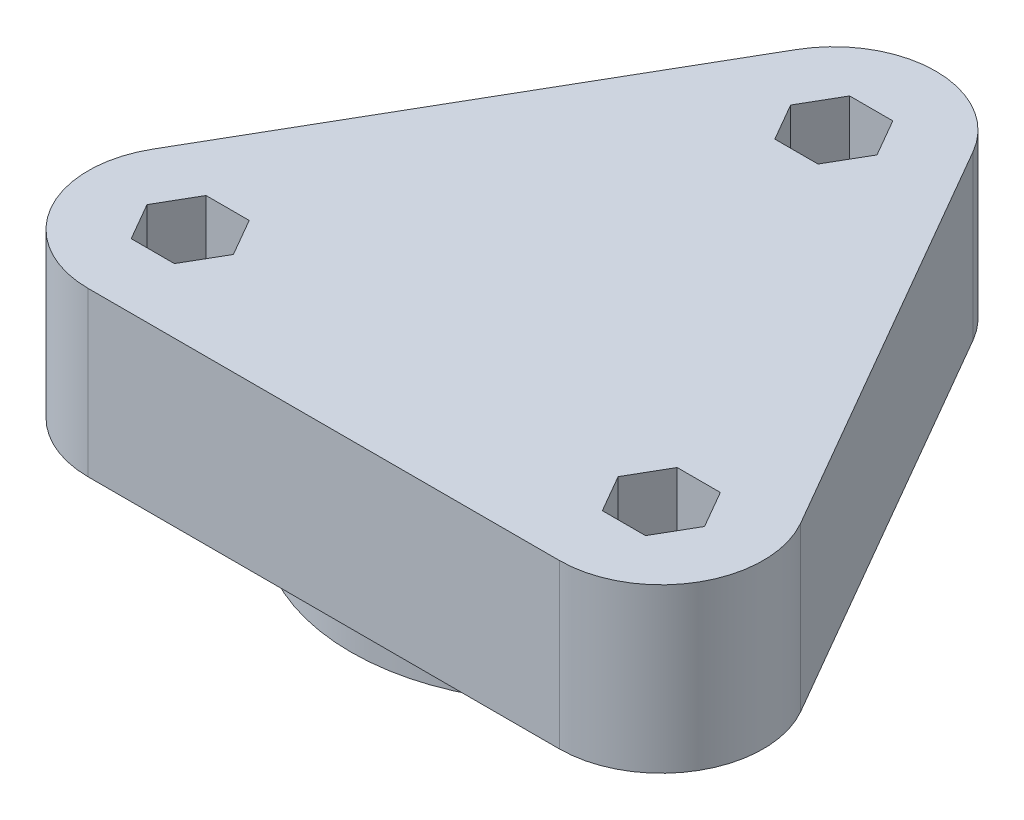
ISO-10303-21;
HEADER;
FILE_DESCRIPTION(('STEP AP214'),'2;1');
FILE_NAME('part.step','',(''),(''),'','','');
FILE_SCHEMA(('AUTOMOTIVE_DESIGN { 1 0 10303 214 1 1 1 1 }'));
ENDSEC;
DATA;
#1=APPLICATION_CONTEXT('core data for automotive mechanical design processes');
#2=APPLICATION_PROTOCOL_DEFINITION('international standard','automotive_design',2000,#1);
#3=PRODUCT_CONTEXT('',#1,'mechanical');
#4=PRODUCT('Part','Part','',(#3));
#5=PRODUCT_RELATED_PRODUCT_CATEGORY('part','',(#4));
#6=PRODUCT_DEFINITION_FORMATION('','',#4);
#7=PRODUCT_DEFINITION_CONTEXT('part definition',#1,'design');
#8=PRODUCT_DEFINITION('design','',#6,#7);
#9=PRODUCT_DEFINITION_SHAPE('','',#8);
#10=(LENGTH_UNIT() NAMED_UNIT(*) SI_UNIT(.MILLI.,.METRE.));
#11=(NAMED_UNIT(*) PLANE_ANGLE_UNIT() SI_UNIT($,.RADIAN.));
#12=(NAMED_UNIT(*) SI_UNIT($,.STERADIAN.) SOLID_ANGLE_UNIT());
#13=UNCERTAINTY_MEASURE_WITH_UNIT(LENGTH_MEASURE(1.E-05),#10,'distance_accuracy_value','');
#14=(GEOMETRIC_REPRESENTATION_CONTEXT(3) GLOBAL_UNCERTAINTY_ASSIGNED_CONTEXT((#13)) GLOBAL_UNIT_ASSIGNED_CONTEXT((#10,
#11,#12)) REPRESENTATION_CONTEXT('',''));
#15=CARTESIAN_POINT('',(0.,0.,0.));
#16=DIRECTION('',(0.,0.,1.));
#17=DIRECTION('',(1.,0.,0.));
#18=AXIS2_PLACEMENT_3D('',#15,#16,#17);
#19=CARTESIAN_POINT('',(0.,0.,-20.));
#20=DIRECTION('',(0.,1.,0.));
#21=DIRECTION('',(0.,0.,1.));
#22=AXIS2_PLACEMENT_3D('',#19,#20,#21);
#23=PLANE('',#22);
#24=CARTESIAN_POINT('',(17.3205080756887,0.,10.0000000000001));
#25=DIRECTION('',(0.,1.,0.));
#26=DIRECTION('',(0.,0.,1.));
#27=AXIS2_PLACEMENT_3D('',#24,#25,#26);
#28=CIRCLE('',#27,1.6);
#29=CARTESIAN_POINT('',(17.3205080756887,0.,11.6000000000001));
#30=VERTEX_POINT('',#29);
#31=EDGE_CURVE('E350',#30,#30,#28,.T.);
#32=ORIENTED_EDGE('',*,*,#31,.T.);
#33=EDGE_LOOP('',(#32));
#34=FACE_BOUND('',#33,.T.);
#35=CARTESIAN_POINT('',(-17.3205080756887,0.,10.0000000000001));
#36=DIRECTION('',(0.,1.,0.));
#37=DIRECTION('',(0.,0.,1.));
#38=AXIS2_PLACEMENT_3D('',#35,#36,#37);
#39=CIRCLE('',#38,1.6);
#40=CARTESIAN_POINT('',(-17.3205080756887,0.,11.6000000000001));
#41=VERTEX_POINT('',#40);
#42=EDGE_CURVE('E353',#41,#41,#39,.T.);
#43=ORIENTED_EDGE('',*,*,#42,.T.);
#44=EDGE_LOOP('',(#43));
#45=FACE_BOUND('',#44,.T.);
#46=CARTESIAN_POINT('',(0.,0.,-20.));
#47=DIRECTION('',(0.,1.,0.));
#48=DIRECTION('',(0.,0.,1.));
#49=AXIS2_PLACEMENT_3D('',#46,#47,#48);
#50=CIRCLE('',#49,1.6);
#51=CARTESIAN_POINT('',(0.,0.,-18.4));
#52=VERTEX_POINT('',#51);
#53=EDGE_CURVE('E356',#52,#52,#50,.T.);
#54=ORIENTED_EDGE('',*,*,#53,.T.);
#55=EDGE_LOOP('',(#54));
#56=FACE_BOUND('',#55,.T.);
#57=CARTESIAN_POINT('',(0.,0.,-20.));
#58=DIRECTION('',(0.,1.,0.));
#59=DIRECTION('',(0.,0.,1.));
#60=AXIS2_PLACEMENT_3D('',#57,#58,#59);
#61=CIRCLE('',#60,7.49999999999992);
#62=CARTESIAN_POINT('',(6.49519052838323,0.,-23.7499999999999));
#63=VERTEX_POINT('',#62);
#64=CARTESIAN_POINT('',(-6.49519052838323,0.,-23.7499999999999));
#65=VERTEX_POINT('',#64);
#66=EDGE_CURVE('E359',#63,#65,#61,.T.);
#67=ORIENTED_EDGE('',*,*,#66,.F.);
#68=DIRECTION('',(-0.499999999999998,0.,-0.86602540378444));
#69=VECTOR('',#68,1.);
#70=CARTESIAN_POINT('',(6.49519052838323,0.,-23.7499999999999));
#71=LINE('',#70,#69);
#72=CARTESIAN_POINT('',(23.815698604072,0.,6.25000000000013));
#73=VERTEX_POINT('',#72);
#74=EDGE_CURVE('E364',#73,#63,#71,.T.);
#75=ORIENTED_EDGE('',*,*,#74,.F.);
#76=CARTESIAN_POINT('',(17.3205080756887,0.,10.0000000000001));
#77=DIRECTION('',(0.,1.,0.));
#78=DIRECTION('',(0.,0.,1.));
#79=AXIS2_PLACEMENT_3D('',#76,#77,#78);
#80=CIRCLE('',#79,7.49999999999993);
#81=CARTESIAN_POINT('',(17.3205080756887,0.,17.5));
#82=VERTEX_POINT('',#81);
#83=EDGE_CURVE('E383',#82,#73,#80,.T.);
#84=ORIENTED_EDGE('',*,*,#83,.F.);
#85=DIRECTION('',(1.,0.,0.));
#86=VECTOR('',#85,1.);
#87=CARTESIAN_POINT('',(-17.3205080756887,0.,17.5));
#88=LINE('',#87,#86);
#89=CARTESIAN_POINT('',(-17.3205080756887,0.,17.5));
#90=VERTEX_POINT('',#89);
#91=EDGE_CURVE('E381',#90,#82,#88,.T.);
#92=ORIENTED_EDGE('',*,*,#91,.F.);
#93=CARTESIAN_POINT('',(-17.3205080756887,0.,10.0000000000001));
#94=DIRECTION('',(0.,1.,0.));
#95=DIRECTION('',(0.,0.,1.));
#96=AXIS2_PLACEMENT_3D('',#93,#94,#95);
#97=CIRCLE('',#96,7.49999999999993);
#98=CARTESIAN_POINT('',(-23.815698604072,0.,6.25000000000013));
#99=VERTEX_POINT('',#98);
#100=EDGE_CURVE('E379',#99,#90,#97,.T.);
#101=ORIENTED_EDGE('',*,*,#100,.F.);
#102=DIRECTION('',(-0.499999999999998,0.,0.86602540378444));
#103=VECTOR('',#102,1.);
#104=CARTESIAN_POINT('',(-6.49519052838323,0.,-23.7499999999999));
#105=LINE('',#104,#103);
#106=EDGE_CURVE('E377',#65,#99,#105,.T.);
#107=ORIENTED_EDGE('',*,*,#106,.F.);
#108=EDGE_LOOP('',(#67,#75,#84,#92,#101,#107));
#109=FACE_BOUND('',#108,.T.);
#110=CARTESIAN_POINT('',(0.,0.,0.));
#111=DIRECTION('',(0.,1.,0.));
#112=DIRECTION('',(0.,0.,1.));
#113=AXIS2_PLACEMENT_3D('',#110,#111,#112);
#114=CIRCLE('',#113,15.5);
#115=CARTESIAN_POINT('',(0.,0.,15.5));
#116=VERTEX_POINT('',#115);
#117=EDGE_CURVE('E11',#116,#116,#114,.F.);
#118=ORIENTED_EDGE('',*,*,#117,.F.);
#119=EDGE_LOOP('',(#118));
#120=FACE_BOUND('',#119,.T.);
#121=ADVANCED_FACE('F35',(#34,#45,#56,#109,#120),#23,.F.);
#122=CARTESIAN_POINT('',(17.3205080756887,12.,10.0000000000001));
#123=DIRECTION('',(0.,-1.,0.));
#124=DIRECTION('',(0.,0.,-1.));
#125=AXIS2_PLACEMENT_3D('',#122,#123,#124);
#126=CYLINDRICAL_SURFACE('',#125,1.6);
#127=ORIENTED_EDGE('',*,*,#31,.F.);
#128=EDGE_LOOP('',(#127));
#129=FACE_BOUND('',#128,.T.);
#130=CARTESIAN_POINT('',(17.3205080756887,7.,10.0000000000001));
#131=DIRECTION('',(0.,1.,0.));
#132=DIRECTION('',(0.,0.,1.));
#133=AXIS2_PLACEMENT_3D('',#130,#131,#132);
#134=CIRCLE('',#133,1.6);
#135=CARTESIAN_POINT('',(17.3205080756887,7.,11.6000000000001));
#136=VERTEX_POINT('',#135);
#137=EDGE_CURVE('E246',#136,#136,#134,.T.);
#138=ORIENTED_EDGE('',*,*,#137,.T.);
#139=EDGE_LOOP('',(#138));
#140=FACE_BOUND('',#139,.T.);
#141=ADVANCED_FACE('F408',(#129,#140),#126,.F.);
#142=CARTESIAN_POINT('',(0.,12.,-20.));
#143=DIRECTION('',(0.,-1.,0.));
#144=DIRECTION('',(0.,0.,-1.));
#145=AXIS2_PLACEMENT_3D('',#142,#143,#144);
#146=CYLINDRICAL_SURFACE('',#145,1.6);
#147=ORIENTED_EDGE('',*,*,#53,.F.);
#148=EDGE_LOOP('',(#147));
#149=FACE_BOUND('',#148,.T.);
#150=CARTESIAN_POINT('',(0.,7.,-20.));
#151=DIRECTION('',(0.,1.,0.));
#152=DIRECTION('',(0.,0.,1.));
#153=AXIS2_PLACEMENT_3D('',#150,#151,#152);
#154=CIRCLE('',#153,1.6);
#155=CARTESIAN_POINT('',(0.,7.,-18.4));
#156=VERTEX_POINT('',#155);
#157=EDGE_CURVE('E291',#156,#156,#154,.T.);
#158=ORIENTED_EDGE('',*,*,#157,.T.);
#159=EDGE_LOOP('',(#158));
#160=FACE_BOUND('',#159,.T.);
#161=ADVANCED_FACE('F430',(#149,#160),#146,.F.);
#162=CARTESIAN_POINT('',(-17.3205080756887,12.,10.0000000000001));
#163=DIRECTION('',(0.,-1.,0.));
#164=DIRECTION('',(0.,0.,-1.));
#165=AXIS2_PLACEMENT_3D('',#162,#163,#164);
#166=CYLINDRICAL_SURFACE('',#165,1.6);
#167=ORIENTED_EDGE('',*,*,#42,.F.);
#168=EDGE_LOOP('',(#167));
#169=FACE_BOUND('',#168,.T.);
#170=CARTESIAN_POINT('',(-17.3205080756887,7.,10.0000000000001));
#171=DIRECTION('',(0.,1.,0.));
#172=DIRECTION('',(0.,0.,1.));
#173=AXIS2_PLACEMENT_3D('',#170,#171,#172);
#174=CIRCLE('',#173,1.6);
#175=CARTESIAN_POINT('',(-17.3205080756887,7.,11.6000000000001));
#176=VERTEX_POINT('',#175);
#177=EDGE_CURVE('E339',#176,#176,#174,.T.);
#178=ORIENTED_EDGE('',*,*,#177,.T.);
#179=EDGE_LOOP('',(#178));
#180=FACE_BOUND('',#179,.T.);
#181=ADVANCED_FACE('F481',(#169,#180),#166,.F.);
#182=CARTESIAN_POINT('',(0.,12.,-20.));
#183=DIRECTION('',(0.,1.,0.));
#184=DIRECTION('',(0.,0.,1.));
#185=AXIS2_PLACEMENT_3D('',#182,#183,#184);
#186=PLANE('',#185);
#187=DIRECTION('',(-0.500000000000001,0.,-0.866025403784438));
#188=VECTOR('',#187,1.);
#189=CARTESIAN_POINT('',(20.4959345562317,12.,10.0000000000001));
#190=LINE('',#189,#188);
#191=CARTESIAN_POINT('',(20.4959345562317,12.,10.0000000000001));
#192=VERTEX_POINT('',#191);
#193=CARTESIAN_POINT('',(18.9082213159602,12.,7.25000000000007));
#194=VERTEX_POINT('',#193);
#195=EDGE_CURVE('E50',#192,#194,#190,.T.);
#196=ORIENTED_EDGE('',*,*,#195,.F.);
#197=DIRECTION('',(0.5,0.,-0.866025403784439));
#198=VECTOR('',#197,1.);
#199=CARTESIAN_POINT('',(18.9082213159602,12.,12.7500000000001));
#200=LINE('',#199,#198);
#201=CARTESIAN_POINT('',(18.9082213159602,12.,12.7500000000001));
#202=VERTEX_POINT('',#201);
#203=EDGE_CURVE('E217',#202,#192,#200,.T.);
#204=ORIENTED_EDGE('',*,*,#203,.F.);
#205=DIRECTION('',(1.,0.,0.));
#206=VECTOR('',#205,1.);
#207=CARTESIAN_POINT('',(15.7327948354173,12.,12.7500000000001));
#208=LINE('',#207,#206);
#209=CARTESIAN_POINT('',(15.7327948354173,12.,12.7500000000001));
#210=VERTEX_POINT('',#209);
#211=EDGE_CURVE('E220',#210,#202,#208,.T.);
#212=ORIENTED_EDGE('',*,*,#211,.F.);
#213=DIRECTION('',(0.500000000000001,0.,0.866025403784438));
#214=VECTOR('',#213,1.);
#215=CARTESIAN_POINT('',(14.1450815951458,12.,10.0000000000001));
#216=LINE('',#215,#214);
#217=CARTESIAN_POINT('',(14.1450815951458,12.,10.0000000000001));
#218=VERTEX_POINT('',#217);
#219=EDGE_CURVE('E239',#218,#210,#216,.T.);
#220=ORIENTED_EDGE('',*,*,#219,.F.);
#221=DIRECTION('',(-0.500000000000001,0.,0.866025403784438));
#222=VECTOR('',#221,1.);
#223=CARTESIAN_POINT('',(15.7327948354173,12.,7.25000000000008));
#224=LINE('',#223,#222);
#225=CARTESIAN_POINT('',(15.7327948354173,12.,7.25000000000008));
#226=VERTEX_POINT('',#225);
#227=EDGE_CURVE('E236',#226,#218,#224,.T.);
#228=ORIENTED_EDGE('',*,*,#227,.F.);
#229=DIRECTION('',(-1.,0.,0.));
#230=VECTOR('',#229,1.);
#231=CARTESIAN_POINT('',(18.9082213159602,12.,7.25000000000008));
#232=LINE('',#231,#230);
#233=EDGE_CURVE('E234',#194,#226,#232,.T.);
#234=ORIENTED_EDGE('',*,*,#233,.F.);
#235=EDGE_LOOP('',(#196,#204,#212,#220,#228,#234));
#236=FACE_BOUND('',#235,.T.);
#237=DIRECTION('',(-1.,0.,0.));
#238=VECTOR('',#237,1.);
#239=CARTESIAN_POINT('',(1.58771324027147,12.,-22.75));
#240=LINE('',#239,#238);
#241=CARTESIAN_POINT('',(1.58771324027147,12.,-22.75));
#242=VERTEX_POINT('',#241);
#243=CARTESIAN_POINT('',(-1.58771324027147,12.,-22.75));
#244=VERTEX_POINT('',#243);
#245=EDGE_CURVE('E58',#242,#244,#240,.T.);
#246=ORIENTED_EDGE('',*,*,#245,.F.);
#247=DIRECTION('',(-0.5,0.,-0.866025403784439));
#248=VECTOR('',#247,1.);
#249=CARTESIAN_POINT('',(3.17542648054294,12.,-20.));
#250=LINE('',#249,#248);
#251=CARTESIAN_POINT('',(3.17542648054294,12.,-20.));
#252=VERTEX_POINT('',#251);
#253=EDGE_CURVE('E258',#252,#242,#250,.T.);
#254=ORIENTED_EDGE('',*,*,#253,.F.);
#255=DIRECTION('',(0.5,0.,-0.866025403784439));
#256=VECTOR('',#255,1.);
#257=CARTESIAN_POINT('',(1.58771324027147,12.,-17.25));
#258=LINE('',#257,#256);
#259=CARTESIAN_POINT('',(1.58771324027147,12.,-17.25));
#260=VERTEX_POINT('',#259);
#261=EDGE_CURVE('E284',#260,#252,#258,.T.);
#262=ORIENTED_EDGE('',*,*,#261,.F.);
#263=DIRECTION('',(1.,0.,0.));
#264=VECTOR('',#263,1.);
#265=CARTESIAN_POINT('',(-1.58771324027147,12.,-17.25));
#266=LINE('',#265,#264);
#267=CARTESIAN_POINT('',(-1.58771324027147,12.,-17.25));
#268=VERTEX_POINT('',#267);
#269=EDGE_CURVE('E281',#268,#260,#266,.T.);
#270=ORIENTED_EDGE('',*,*,#269,.F.);
#271=DIRECTION('',(0.5,0.,0.866025403784439));
#272=VECTOR('',#271,1.);
#273=CARTESIAN_POINT('',(-3.17542648054294,12.,-20.));
#274=LINE('',#273,#272);
#275=CARTESIAN_POINT('',(-3.17542648054294,12.,-20.));
#276=VERTEX_POINT('',#275);
#277=EDGE_CURVE('E278',#276,#268,#274,.T.);
#278=ORIENTED_EDGE('',*,*,#277,.F.);
#279=DIRECTION('',(-0.499999999999999,0.,0.866025403784439));
#280=VECTOR('',#279,1.);
#281=CARTESIAN_POINT('',(-1.58771324027147,12.,-22.75));
#282=LINE('',#281,#280);
#283=EDGE_CURVE('E275',#244,#276,#282,.T.);
#284=ORIENTED_EDGE('',*,*,#283,.F.);
#285=EDGE_LOOP('',(#246,#254,#262,#270,#278,#284));
#286=FACE_BOUND('',#285,.T.);
#287=DIRECTION('',(-1.,0.,0.));
#288=VECTOR('',#287,1.);
#289=CARTESIAN_POINT('',(-15.7327948354173,12.,7.25000000000008));
#290=LINE('',#289,#288);
#291=CARTESIAN_POINT('',(-15.7327948354173,12.,7.25000000000008));
#292=VERTEX_POINT('',#291);
#293=CARTESIAN_POINT('',(-18.9082213159602,12.,7.25000000000008));
#294=VERTEX_POINT('',#293);
#295=EDGE_CURVE('E321',#292,#294,#290,.T.);
#296=ORIENTED_EDGE('',*,*,#295,.F.);
#297=DIRECTION('',(-0.5,0.,-0.866025403784439));
#298=VECTOR('',#297,1.);
#299=CARTESIAN_POINT('',(-14.1450815951458,12.,10.0000000000001));
#300=LINE('',#299,#298);
#301=CARTESIAN_POINT('',(-14.1450815951458,12.,10.0000000000001));
#302=VERTEX_POINT('',#301);
#303=EDGE_CURVE('E305',#302,#292,#300,.T.);
#304=ORIENTED_EDGE('',*,*,#303,.F.);
#305=DIRECTION('',(0.5,0.,-0.866025403784439));
#306=VECTOR('',#305,1.);
#307=CARTESIAN_POINT('',(-15.7327948354173,12.,12.7500000000001));
#308=LINE('',#307,#306);
#309=CARTESIAN_POINT('',(-15.7327948354173,12.,12.7500000000001));
#310=VERTEX_POINT('',#309);
#311=EDGE_CURVE('E332',#310,#302,#308,.T.);
#312=ORIENTED_EDGE('',*,*,#311,.F.);
#313=DIRECTION('',(1.,0.,0.));
#314=VECTOR('',#313,1.);
#315=CARTESIAN_POINT('',(-18.9082213159602,12.,12.7500000000001));
#316=LINE('',#315,#314);
#317=CARTESIAN_POINT('',(-18.9082213159602,12.,12.7500000000001));
#318=VERTEX_POINT('',#317);
#319=EDGE_CURVE('E329',#318,#310,#316,.T.);
#320=ORIENTED_EDGE('',*,*,#319,.F.);
#321=DIRECTION('',(0.5,0.,0.866025403784439));
#322=VECTOR('',#321,1.);
#323=CARTESIAN_POINT('',(-20.4959345562317,12.,10.0000000000001));
#324=LINE('',#323,#322);
#325=CARTESIAN_POINT('',(-20.4959345562317,12.,10.0000000000001));
#326=VERTEX_POINT('',#325);
#327=EDGE_CURVE('E326',#326,#318,#324,.T.);
#328=ORIENTED_EDGE('',*,*,#327,.F.);
#329=DIRECTION('',(-0.5,0.,0.866025403784439));
#330=VECTOR('',#329,1.);
#331=CARTESIAN_POINT('',(-18.9082213159602,12.,7.25000000000008));
#332=LINE('',#331,#330);
#333=EDGE_CURVE('E323',#294,#326,#332,.T.);
#334=ORIENTED_EDGE('',*,*,#333,.F.);
#335=EDGE_LOOP('',(#296,#304,#312,#320,#328,#334));
#336=FACE_BOUND('',#335,.T.);
#337=CARTESIAN_POINT('',(0.,12.,-20.));
#338=DIRECTION('',(0.,1.,0.));
#339=DIRECTION('',(0.,0.,1.));
#340=AXIS2_PLACEMENT_3D('',#337,#338,#339);
#341=CIRCLE('',#340,7.49999999999992);
#342=CARTESIAN_POINT('',(6.49519052838323,12.,-23.7499999999999));
#343=VERTEX_POINT('',#342);
#344=CARTESIAN_POINT('',(-6.49519052838323,12.,-23.7499999999999));
#345=VERTEX_POINT('',#344);
#346=EDGE_CURVE('E360',#343,#345,#341,.T.);
#347=ORIENTED_EDGE('',*,*,#346,.T.);
#348=DIRECTION('',(-0.499999999999998,0.,0.86602540378444));
#349=VECTOR('',#348,1.);
#350=CARTESIAN_POINT('',(-6.49519052838323,12.,-23.7499999999999));
#351=LINE('',#350,#349);
#352=CARTESIAN_POINT('',(-23.815698604072,12.,6.25000000000013));
#353=VERTEX_POINT('',#352);
#354=EDGE_CURVE('E363',#345,#353,#351,.T.);
#355=ORIENTED_EDGE('',*,*,#354,.T.);
#356=CARTESIAN_POINT('',(-17.3205080756887,12.,10.0000000000001));
#357=DIRECTION('',(0.,1.,0.));
#358=DIRECTION('',(0.,0.,1.));
#359=AXIS2_PLACEMENT_3D('',#356,#357,#358);
#360=CIRCLE('',#359,7.49999999999993);
#361=CARTESIAN_POINT('',(-17.3205080756887,12.,17.5));
#362=VERTEX_POINT('',#361);
#363=EDGE_CURVE('E366',#353,#362,#360,.T.);
#364=ORIENTED_EDGE('',*,*,#363,.T.);
#365=DIRECTION('',(1.,0.,0.));
#366=VECTOR('',#365,1.);
#367=CARTESIAN_POINT('',(-17.3205080756887,12.,17.5));
#368=LINE('',#367,#366);
#369=CARTESIAN_POINT('',(17.3205080756887,12.,17.5));
#370=VERTEX_POINT('',#369);
#371=EDGE_CURVE('E368',#362,#370,#368,.T.);
#372=ORIENTED_EDGE('',*,*,#371,.T.);
#373=CARTESIAN_POINT('',(17.3205080756887,12.,10.0000000000001));
#374=DIRECTION('',(0.,1.,0.));
#375=DIRECTION('',(0.,0.,1.));
#376=AXIS2_PLACEMENT_3D('',#373,#374,#375);
#377=CIRCLE('',#376,7.49999999999993);
#378=CARTESIAN_POINT('',(23.815698604072,12.,6.25000000000013));
#379=VERTEX_POINT('',#378);
#380=EDGE_CURVE('E370',#370,#379,#377,.T.);
#381=ORIENTED_EDGE('',*,*,#380,.T.);
#382=DIRECTION('',(-0.499999999999998,0.,-0.86602540378444));
#383=VECTOR('',#382,1.);
#384=CARTESIAN_POINT('',(6.49519052838323,12.,-23.7499999999999));
#385=LINE('',#384,#383);
#386=EDGE_CURVE('E372',#379,#343,#385,.T.);
#387=ORIENTED_EDGE('',*,*,#386,.T.);
#388=EDGE_LOOP('',(#347,#355,#364,#372,#381,#387));
#389=FACE_BOUND('',#388,.T.);
#390=ADVANCED_FACE('F436',(#236,#286,#336,#389),#186,.T.);
#391=CARTESIAN_POINT('',(0.,12.,-20.));
#392=DIRECTION('',(0.,-1.,0.));
#393=DIRECTION('',(0.,0.,-1.));
#394=AXIS2_PLACEMENT_3D('',#391,#392,#393);
#395=CYLINDRICAL_SURFACE('',#394,7.49999999999992);
#396=ORIENTED_EDGE('',*,*,#66,.T.);
#397=DIRECTION('',(0.,-1.,0.));
#398=VECTOR('',#397,1.);
#399=CARTESIAN_POINT('',(-6.49519052838323,12.,-23.7499999999999));
#400=LINE('',#399,#398);
#401=EDGE_CURVE('E43',#345,#65,#400,.T.);
#402=ORIENTED_EDGE('',*,*,#401,.F.);
#403=ORIENTED_EDGE('',*,*,#346,.F.);
#404=DIRECTION('',(0.,-1.,0.));
#405=VECTOR('',#404,1.);
#406=CARTESIAN_POINT('',(6.49519052838323,12.,-23.7499999999999));
#407=LINE('',#406,#405);
#408=EDGE_CURVE('E374',#343,#63,#407,.T.);
#409=ORIENTED_EDGE('',*,*,#408,.T.);
#410=EDGE_LOOP('',(#396,#402,#403,#409));
#411=FACE_BOUND('',#410,.T.);
#412=ADVANCED_FACE('F37',(#411),#395,.T.);
#413=CARTESIAN_POINT('',(-6.49519052838323,12.,-23.7499999999999));
#414=DIRECTION('',(0.86602540378444,0.,0.499999999999998));
#415=DIRECTION('',(0.499999999999998,0.,-0.86602540378444));
#416=AXIS2_PLACEMENT_3D('',#413,#414,#415);
#417=PLANE('',#416);
#418=ORIENTED_EDGE('',*,*,#106,.T.);
#419=DIRECTION('',(0.,-1.,0.));
#420=VECTOR('',#419,1.);
#421=CARTESIAN_POINT('',(-23.815698604072,12.,6.25000000000013));
#422=LINE('',#421,#420);
#423=EDGE_CURVE('E397',#353,#99,#422,.T.);
#424=ORIENTED_EDGE('',*,*,#423,.F.);
#425=ORIENTED_EDGE('',*,*,#354,.F.);
#426=ORIENTED_EDGE('',*,*,#401,.T.);
#427=EDGE_LOOP('',(#418,#424,#425,#426));
#428=FACE_BOUND('',#427,.T.);
#429=ADVANCED_FACE('F453',(#428),#417,.F.);
#430=CARTESIAN_POINT('',(-17.3205080756887,12.,10.0000000000001));
#431=DIRECTION('',(0.,-1.,0.));
#432=DIRECTION('',(0.,0.,-1.));
#433=AXIS2_PLACEMENT_3D('',#430,#431,#432);
#434=CYLINDRICAL_SURFACE('',#433,7.49999999999993);
#435=ORIENTED_EDGE('',*,*,#100,.T.);
#436=DIRECTION('',(0.,-1.,0.));
#437=VECTOR('',#436,1.);
#438=CARTESIAN_POINT('',(-17.3205080756887,12.,17.5));
#439=LINE('',#438,#437);
#440=EDGE_CURVE('E394',#362,#90,#439,.T.);
#441=ORIENTED_EDGE('',*,*,#440,.F.);
#442=ORIENTED_EDGE('',*,*,#363,.F.);
#443=ORIENTED_EDGE('',*,*,#423,.T.);
#444=EDGE_LOOP('',(#435,#441,#442,#443));
#445=FACE_BOUND('',#444,.T.);
#446=ADVANCED_FACE('F450',(#445),#434,.T.);
#447=CARTESIAN_POINT('',(-17.3205080756887,12.,17.5));
#448=DIRECTION('',(0.,0.,-1.));
#449=DIRECTION('',(-1.,0.,0.));
#450=AXIS2_PLACEMENT_3D('',#447,#448,#449);
#451=PLANE('',#450);
#452=ORIENTED_EDGE('',*,*,#91,.T.);
#453=DIRECTION('',(0.,-1.,0.));
#454=VECTOR('',#453,1.);
#455=CARTESIAN_POINT('',(17.3205080756887,12.,17.5));
#456=LINE('',#455,#454);
#457=EDGE_CURVE('E391',#370,#82,#456,.T.);
#458=ORIENTED_EDGE('',*,*,#457,.F.);
#459=ORIENTED_EDGE('',*,*,#371,.F.);
#460=ORIENTED_EDGE('',*,*,#440,.T.);
#461=EDGE_LOOP('',(#452,#458,#459,#460));
#462=FACE_BOUND('',#461,.T.);
#463=ADVANCED_FACE('F446',(#462),#451,.F.);
#464=CARTESIAN_POINT('',(17.3205080756887,12.,10.0000000000001));
#465=DIRECTION('',(0.,-1.,0.));
#466=DIRECTION('',(0.,0.,-1.));
#467=AXIS2_PLACEMENT_3D('',#464,#465,#466);
#468=CYLINDRICAL_SURFACE('',#467,7.49999999999993);
#469=ORIENTED_EDGE('',*,*,#83,.T.);
#470=DIRECTION('',(0.,-1.,0.));
#471=VECTOR('',#470,1.);
#472=CARTESIAN_POINT('',(23.815698604072,12.,6.25000000000013));
#473=LINE('',#472,#471);
#474=EDGE_CURVE('E388',#379,#73,#473,.T.);
#475=ORIENTED_EDGE('',*,*,#474,.F.);
#476=ORIENTED_EDGE('',*,*,#380,.F.);
#477=ORIENTED_EDGE('',*,*,#457,.T.);
#478=EDGE_LOOP('',(#469,#475,#476,#477));
#479=FACE_BOUND('',#478,.T.);
#480=ADVANCED_FACE('F442',(#479),#468,.T.);
#481=CARTESIAN_POINT('',(6.49519052838323,12.,-23.7499999999999));
#482=DIRECTION('',(-0.86602540378444,0.,0.499999999999998));
#483=DIRECTION('',(0.499999999999998,0.,0.86602540378444));
#484=AXIS2_PLACEMENT_3D('',#481,#482,#483);
#485=PLANE('',#484);
#486=ORIENTED_EDGE('',*,*,#74,.T.);
#487=ORIENTED_EDGE('',*,*,#408,.F.);
#488=ORIENTED_EDGE('',*,*,#386,.F.);
#489=ORIENTED_EDGE('',*,*,#474,.T.);
#490=EDGE_LOOP('',(#486,#487,#488,#489));
#491=FACE_BOUND('',#490,.T.);
#492=ADVANCED_FACE('F438',(#491),#485,.F.);
#493=CARTESIAN_POINT('',(-15.7327948354173,7.,7.25000000000008));
#494=DIRECTION('',(0.,0.,-1.));
#495=DIRECTION('',(-1.,0.,0.));
#496=AXIS2_PLACEMENT_3D('',#493,#494,#495);
#497=PLANE('',#496);
#498=ORIENTED_EDGE('',*,*,#295,.T.);
#499=DIRECTION('',(0.,1.,0.));
#500=VECTOR('',#499,1.);
#501=CARTESIAN_POINT('',(-18.9082213159602,7.,7.25000000000008));
#502=LINE('',#501,#500);
#503=CARTESIAN_POINT('',(-18.9082213159602,7.,7.25000000000008));
#504=VERTEX_POINT('',#503);
#505=EDGE_CURVE('E320',#504,#294,#502,.T.);
#506=ORIENTED_EDGE('',*,*,#505,.F.);
#507=DIRECTION('',(-1.,0.,0.));
#508=VECTOR('',#507,1.);
#509=CARTESIAN_POINT('',(-15.7327948354173,7.,7.25000000000008));
#510=LINE('',#509,#508);
#511=CARTESIAN_POINT('',(-15.7327948354173,7.,7.25000000000008));
#512=VERTEX_POINT('',#511);
#513=EDGE_CURVE('E301',#512,#504,#510,.T.);
#514=ORIENTED_EDGE('',*,*,#513,.F.);
#515=DIRECTION('',(0.,1.,0.));
#516=VECTOR('',#515,1.);
#517=CARTESIAN_POINT('',(-15.7327948354173,7.,7.25000000000008));
#518=LINE('',#517,#516);
#519=EDGE_CURVE('E337',#512,#292,#518,.T.);
#520=ORIENTED_EDGE('',*,*,#519,.T.);
#521=EDGE_LOOP('',(#498,#506,#514,#520));
#522=FACE_BOUND('',#521,.T.);
#523=ADVANCED_FACE('F441',(#522),#497,.F.);
#524=CARTESIAN_POINT('',(-14.1450815951458,7.,10.0000000000001));
#525=DIRECTION('',(0.866025403784439,0.,-0.5));
#526=DIRECTION('',(-0.5,0.,-0.866025403784439));
#527=AXIS2_PLACEMENT_3D('',#524,#525,#526);
#528=PLANE('',#527);
#529=ORIENTED_EDGE('',*,*,#303,.T.);
#530=ORIENTED_EDGE('',*,*,#519,.F.);
#531=DIRECTION('',(-0.5,0.,-0.866025403784439));
#532=VECTOR('',#531,1.);
#533=CARTESIAN_POINT('',(-14.1450815951458,7.,10.0000000000001));
#534=LINE('',#533,#532);
#535=CARTESIAN_POINT('',(-14.1450815951458,7.,10.0000000000001));
#536=VERTEX_POINT('',#535);
#537=EDGE_CURVE('E317',#536,#512,#534,.T.);
#538=ORIENTED_EDGE('',*,*,#537,.F.);
#539=DIRECTION('',(0.,1.,0.));
#540=VECTOR('',#539,1.);
#541=CARTESIAN_POINT('',(-14.1450815951458,7.,10.0000000000001));
#542=LINE('',#541,#540);
#543=EDGE_CURVE('E340',#536,#302,#542,.T.);
#544=ORIENTED_EDGE('',*,*,#543,.T.);
#545=EDGE_LOOP('',(#529,#530,#538,#544));
#546=FACE_BOUND('',#545,.T.);
#547=ADVANCED_FACE('F509',(#546),#528,.F.);
#548=CARTESIAN_POINT('',(-15.7327948354173,7.,12.7500000000001));
#549=DIRECTION('',(0.866025403784439,0.,0.5));
#550=DIRECTION('',(0.5,0.,-0.866025403784439));
#551=AXIS2_PLACEMENT_3D('',#548,#549,#550);
#552=PLANE('',#551);
#553=ORIENTED_EDGE('',*,*,#311,.T.);
#554=ORIENTED_EDGE('',*,*,#543,.F.);
#555=DIRECTION('',(0.5,0.,-0.866025403784439));
#556=VECTOR('',#555,1.);
#557=CARTESIAN_POINT('',(-15.7327948354173,7.,12.7500000000001));
#558=LINE('',#557,#556);
#559=CARTESIAN_POINT('',(-15.7327948354173,7.,12.7500000000001));
#560=VERTEX_POINT('',#559);
#561=EDGE_CURVE('E314',#560,#536,#558,.T.);
#562=ORIENTED_EDGE('',*,*,#561,.F.);
#563=DIRECTION('',(0.,1.,0.));
#564=VECTOR('',#563,1.);
#565=CARTESIAN_POINT('',(-15.7327948354173,7.,12.7500000000001));
#566=LINE('',#565,#564);
#567=EDGE_CURVE('E342',#560,#310,#566,.T.);
#568=ORIENTED_EDGE('',*,*,#567,.T.);
#569=EDGE_LOOP('',(#553,#554,#562,#568));
#570=FACE_BOUND('',#569,.T.);
#571=ADVANCED_FACE('F511',(#570),#552,.F.);
#572=CARTESIAN_POINT('',(-18.9082213159602,7.,12.7500000000001));
#573=DIRECTION('',(0.,0.,1.));
#574=DIRECTION('',(1.,0.,0.));
#575=AXIS2_PLACEMENT_3D('',#572,#573,#574);
#576=PLANE('',#575);
#577=ORIENTED_EDGE('',*,*,#319,.T.);
#578=ORIENTED_EDGE('',*,*,#567,.F.);
#579=DIRECTION('',(1.,0.,0.));
#580=VECTOR('',#579,1.);
#581=CARTESIAN_POINT('',(-18.9082213159602,7.,12.7500000000001));
#582=LINE('',#581,#580);
#583=CARTESIAN_POINT('',(-18.9082213159602,7.,12.7500000000001));
#584=VERTEX_POINT('',#583);
#585=EDGE_CURVE('E311',#584,#560,#582,.T.);
#586=ORIENTED_EDGE('',*,*,#585,.F.);
#587=DIRECTION('',(0.,1.,0.));
#588=VECTOR('',#587,1.);
#589=CARTESIAN_POINT('',(-18.9082213159602,7.,12.7500000000001));
#590=LINE('',#589,#588);
#591=EDGE_CURVE('E344',#584,#318,#590,.T.);
#592=ORIENTED_EDGE('',*,*,#591,.T.);
#593=EDGE_LOOP('',(#577,#578,#586,#592));
#594=FACE_BOUND('',#593,.T.);
#595=ADVANCED_FACE('F514',(#594),#576,.F.);
#596=CARTESIAN_POINT('',(-20.4959345562317,7.,10.0000000000001));
#597=DIRECTION('',(-0.866025403784439,0.,0.5));
#598=DIRECTION('',(0.5,0.,0.866025403784439));
#599=AXIS2_PLACEMENT_3D('',#596,#597,#598);
#600=PLANE('',#599);
#601=ORIENTED_EDGE('',*,*,#327,.T.);
#602=ORIENTED_EDGE('',*,*,#591,.F.);
#603=DIRECTION('',(0.5,0.,0.866025403784439));
#604=VECTOR('',#603,1.);
#605=CARTESIAN_POINT('',(-20.4959345562317,7.,10.0000000000001));
#606=LINE('',#605,#604);
#607=CARTESIAN_POINT('',(-20.4959345562317,7.,10.0000000000001));
#608=VERTEX_POINT('',#607);
#609=EDGE_CURVE('E308',#608,#584,#606,.T.);
#610=ORIENTED_EDGE('',*,*,#609,.F.);
#611=DIRECTION('',(0.,1.,0.));
#612=VECTOR('',#611,1.);
#613=CARTESIAN_POINT('',(-20.4959345562317,7.,10.0000000000001));
#614=LINE('',#613,#612);
#615=EDGE_CURVE('E346',#608,#326,#614,.T.);
#616=ORIENTED_EDGE('',*,*,#615,.T.);
#617=EDGE_LOOP('',(#601,#602,#610,#616));
#618=FACE_BOUND('',#617,.T.);
#619=ADVANCED_FACE('F517',(#618),#600,.F.);
#620=CARTESIAN_POINT('',(-18.9082213159602,7.,7.25000000000008));
#621=DIRECTION('',(-0.866025403784439,0.,-0.5));
#622=DIRECTION('',(-0.5,0.,0.866025403784439));
#623=AXIS2_PLACEMENT_3D('',#620,#621,#622);
#624=PLANE('',#623);
#625=ORIENTED_EDGE('',*,*,#333,.T.);
#626=ORIENTED_EDGE('',*,*,#615,.F.);
#627=DIRECTION('',(-0.5,0.,0.866025403784439));
#628=VECTOR('',#627,1.);
#629=CARTESIAN_POINT('',(-18.9082213159602,7.,7.25000000000008));
#630=LINE('',#629,#628);
#631=EDGE_CURVE('E304',#504,#608,#630,.T.);
#632=ORIENTED_EDGE('',*,*,#631,.F.);
#633=ORIENTED_EDGE('',*,*,#505,.T.);
#634=EDGE_LOOP('',(#625,#626,#632,#633));
#635=FACE_BOUND('',#634,.T.);
#636=ADVANCED_FACE('F502',(#635),#624,.F.);
#637=CARTESIAN_POINT('',(0.,7.,0.));
#638=DIRECTION('',(0.,1.,0.));
#639=DIRECTION('',(0.,0.,1.));
#640=AXIS2_PLACEMENT_3D('',#637,#638,#639);
#641=PLANE('',#640);
#642=ORIENTED_EDGE('',*,*,#177,.F.);
#643=EDGE_LOOP('',(#642));
#644=FACE_BOUND('',#643,.T.);
#645=ORIENTED_EDGE('',*,*,#513,.T.);
#646=ORIENTED_EDGE('',*,*,#631,.T.);
#647=ORIENTED_EDGE('',*,*,#609,.T.);
#648=ORIENTED_EDGE('',*,*,#585,.T.);
#649=ORIENTED_EDGE('',*,*,#561,.T.);
#650=ORIENTED_EDGE('',*,*,#537,.T.);
#651=EDGE_LOOP('',(#645,#646,#647,#648,#649,#650));
#652=FACE_BOUND('',#651,.T.);
#653=ADVANCED_FACE('F505',(#644,#652),#641,.T.);
#654=CARTESIAN_POINT('',(1.58771324027147,7.,-22.75));
#655=DIRECTION('',(0.,0.,-1.));
#656=DIRECTION('',(-1.,0.,0.));
#657=AXIS2_PLACEMENT_3D('',#654,#655,#656);
#658=PLANE('',#657);
#659=ORIENTED_EDGE('',*,*,#245,.T.);
#660=DIRECTION('',(0.,1.,0.));
#661=VECTOR('',#660,1.);
#662=CARTESIAN_POINT('',(-1.58771324027147,7.,-22.75));
#663=LINE('',#662,#661);
#664=CARTESIAN_POINT('',(-1.58771324027147,7.,-22.75));
#665=VERTEX_POINT('',#664);
#666=EDGE_CURVE('E273',#665,#244,#663,.T.);
#667=ORIENTED_EDGE('',*,*,#666,.F.);
#668=DIRECTION('',(-1.,0.,0.));
#669=VECTOR('',#668,1.);
#670=CARTESIAN_POINT('',(1.58771324027147,7.,-22.75));
#671=LINE('',#670,#669);
#672=CARTESIAN_POINT('',(1.58771324027147,7.,-22.75));
#673=VERTEX_POINT('',#672);
#674=EDGE_CURVE('E254',#673,#665,#671,.T.);
#675=ORIENTED_EDGE('',*,*,#674,.F.);
#676=DIRECTION('',(0.,1.,0.));
#677=VECTOR('',#676,1.);
#678=CARTESIAN_POINT('',(1.58771324027147,7.,-22.75));
#679=LINE('',#678,#677);
#680=EDGE_CURVE('E289',#673,#242,#679,.T.);
#681=ORIENTED_EDGE('',*,*,#680,.T.);
#682=EDGE_LOOP('',(#659,#667,#675,#681));
#683=FACE_BOUND('',#682,.T.);
#684=ADVANCED_FACE('F678',(#683),#658,.F.);
#685=CARTESIAN_POINT('',(3.17542648054294,7.,-20.));
#686=DIRECTION('',(0.866025403784439,0.,-0.5));
#687=DIRECTION('',(-0.5,0.,-0.866025403784439));
#688=AXIS2_PLACEMENT_3D('',#685,#686,#687);
#689=PLANE('',#688);
#690=ORIENTED_EDGE('',*,*,#253,.T.);
#691=ORIENTED_EDGE('',*,*,#680,.F.);
#692=DIRECTION('',(-0.5,0.,-0.866025403784439));
#693=VECTOR('',#692,1.);
#694=CARTESIAN_POINT('',(3.17542648054294,7.,-20.));
#695=LINE('',#694,#693);
#696=CARTESIAN_POINT('',(3.17542648054294,7.,-20.));
#697=VERTEX_POINT('',#696);
#698=EDGE_CURVE('E270',#697,#673,#695,.T.);
#699=ORIENTED_EDGE('',*,*,#698,.F.);
#700=DIRECTION('',(0.,1.,0.));
#701=VECTOR('',#700,1.);
#702=CARTESIAN_POINT('',(3.17542648054294,7.,-20.));
#703=LINE('',#702,#701);
#704=EDGE_CURVE('E292',#697,#252,#703,.T.);
#705=ORIENTED_EDGE('',*,*,#704,.T.);
#706=EDGE_LOOP('',(#690,#691,#699,#705));
#707=FACE_BOUND('',#706,.T.);
#708=ADVANCED_FACE('F687',(#707),#689,.F.);
#709=CARTESIAN_POINT('',(1.58771324027147,7.,-17.25));
#710=DIRECTION('',(0.866025403784439,0.,0.5));
#711=DIRECTION('',(0.5,0.,-0.866025403784439));
#712=AXIS2_PLACEMENT_3D('',#709,#710,#711);
#713=PLANE('',#712);
#714=ORIENTED_EDGE('',*,*,#261,.T.);
#715=ORIENTED_EDGE('',*,*,#704,.F.);
#716=DIRECTION('',(0.5,0.,-0.866025403784439));
#717=VECTOR('',#716,1.);
#718=CARTESIAN_POINT('',(1.58771324027147,7.,-17.25));
#719=LINE('',#718,#717);
#720=CARTESIAN_POINT('',(1.58771324027147,7.,-17.25));
#721=VERTEX_POINT('',#720);
#722=EDGE_CURVE('E267',#721,#697,#719,.T.);
#723=ORIENTED_EDGE('',*,*,#722,.F.);
#724=DIRECTION('',(0.,1.,0.));
#725=VECTOR('',#724,1.);
#726=CARTESIAN_POINT('',(1.58771324027147,7.,-17.25));
#727=LINE('',#726,#725);
#728=EDGE_CURVE('E294',#721,#260,#727,.T.);
#729=ORIENTED_EDGE('',*,*,#728,.T.);
#730=EDGE_LOOP('',(#714,#715,#723,#729));
#731=FACE_BOUND('',#730,.T.);
#732=ADVANCED_FACE('F695',(#731),#713,.F.);
#733=CARTESIAN_POINT('',(-1.58771324027147,7.,-17.25));
#734=DIRECTION('',(0.,0.,1.));
#735=DIRECTION('',(1.,0.,0.));
#736=AXIS2_PLACEMENT_3D('',#733,#734,#735);
#737=PLANE('',#736);
#738=ORIENTED_EDGE('',*,*,#269,.T.);
#739=ORIENTED_EDGE('',*,*,#728,.F.);
#740=DIRECTION('',(1.,0.,0.));
#741=VECTOR('',#740,1.);
#742=CARTESIAN_POINT('',(-1.58771324027147,7.,-17.25));
#743=LINE('',#742,#741);
#744=CARTESIAN_POINT('',(-1.58771324027147,7.,-17.25));
#745=VERTEX_POINT('',#744);
#746=EDGE_CURVE('E264',#745,#721,#743,.T.);
#747=ORIENTED_EDGE('',*,*,#746,.F.);
#748=DIRECTION('',(0.,1.,0.));
#749=VECTOR('',#748,1.);
#750=CARTESIAN_POINT('',(-1.58771324027147,7.,-17.25));
#751=LINE('',#750,#749);
#752=EDGE_CURVE('E296',#745,#268,#751,.T.);
#753=ORIENTED_EDGE('',*,*,#752,.T.);
#754=EDGE_LOOP('',(#738,#739,#747,#753));
#755=FACE_BOUND('',#754,.T.);
#756=ADVANCED_FACE('F704',(#755),#737,.F.);
#757=CARTESIAN_POINT('',(-3.17542648054294,7.,-20.));
#758=DIRECTION('',(-0.866025403784438,0.,0.5));
#759=DIRECTION('',(0.5,0.,0.866025403784439));
#760=AXIS2_PLACEMENT_3D('',#757,#758,#759);
#761=PLANE('',#760);
#762=ORIENTED_EDGE('',*,*,#277,.T.);
#763=ORIENTED_EDGE('',*,*,#752,.F.);
#764=DIRECTION('',(0.5,0.,0.866025403784439));
#765=VECTOR('',#764,1.);
#766=CARTESIAN_POINT('',(-3.17542648054294,7.,-20.));
#767=LINE('',#766,#765);
#768=CARTESIAN_POINT('',(-3.17542648054294,7.,-20.));
#769=VERTEX_POINT('',#768);
#770=EDGE_CURVE('E261',#769,#745,#767,.T.);
#771=ORIENTED_EDGE('',*,*,#770,.F.);
#772=DIRECTION('',(0.,1.,0.));
#773=VECTOR('',#772,1.);
#774=CARTESIAN_POINT('',(-3.17542648054294,7.,-20.));
#775=LINE('',#774,#773);
#776=EDGE_CURVE('E298',#769,#276,#775,.T.);
#777=ORIENTED_EDGE('',*,*,#776,.T.);
#778=EDGE_LOOP('',(#762,#763,#771,#777));
#779=FACE_BOUND('',#778,.T.);
#780=ADVANCED_FACE('F713',(#779),#761,.F.);
#781=CARTESIAN_POINT('',(-1.58771324027147,7.,-22.75));
#782=DIRECTION('',(-0.866025403784439,0.,-0.499999999999999));
#783=DIRECTION('',(-0.499999999999999,0.,0.866025403784439));
#784=AXIS2_PLACEMENT_3D('',#781,#782,#783);
#785=PLANE('',#784);
#786=ORIENTED_EDGE('',*,*,#283,.T.);
#787=ORIENTED_EDGE('',*,*,#776,.F.);
#788=DIRECTION('',(-0.499999999999999,0.,0.866025403784439));
#789=VECTOR('',#788,1.);
#790=CARTESIAN_POINT('',(-1.58771324027147,7.,-22.75));
#791=LINE('',#790,#789);
#792=EDGE_CURVE('E257',#665,#769,#791,.T.);
#793=ORIENTED_EDGE('',*,*,#792,.F.);
#794=ORIENTED_EDGE('',*,*,#666,.T.);
#795=EDGE_LOOP('',(#786,#787,#793,#794));
#796=FACE_BOUND('',#795,.T.);
#797=ADVANCED_FACE('F722',(#796),#785,.F.);
#798=CARTESIAN_POINT('',(0.,7.,0.));
#799=DIRECTION('',(0.,1.,0.));
#800=DIRECTION('',(0.,0.,1.));
#801=AXIS2_PLACEMENT_3D('',#798,#799,#800);
#802=PLANE('',#801);
#803=ORIENTED_EDGE('',*,*,#157,.F.);
#804=EDGE_LOOP('',(#803));
#805=FACE_BOUND('',#804,.T.);
#806=ORIENTED_EDGE('',*,*,#674,.T.);
#807=ORIENTED_EDGE('',*,*,#792,.T.);
#808=ORIENTED_EDGE('',*,*,#770,.T.);
#809=ORIENTED_EDGE('',*,*,#746,.T.);
#810=ORIENTED_EDGE('',*,*,#722,.T.);
#811=ORIENTED_EDGE('',*,*,#698,.T.);
#812=EDGE_LOOP('',(#806,#807,#808,#809,#810,#811));
#813=FACE_BOUND('',#812,.T.);
#814=ADVANCED_FACE('F731',(#805,#813),#802,.T.);
#815=CARTESIAN_POINT('',(20.4959345562317,7.,10.0000000000001));
#816=DIRECTION('',(0.866025403784438,0.,-0.500000000000001));
#817=DIRECTION('',(-0.500000000000001,0.,-0.866025403784438));
#818=AXIS2_PLACEMENT_3D('',#815,#816,#817);
#819=PLANE('',#818);
#820=ORIENTED_EDGE('',*,*,#195,.T.);
#821=DIRECTION('',(0.,1.,0.));
#822=VECTOR('',#821,1.);
#823=CARTESIAN_POINT('',(18.9082213159602,7.,7.25000000000008));
#824=LINE('',#823,#822);
#825=CARTESIAN_POINT('',(18.9082213159602,7.,7.25000000000008));
#826=VERTEX_POINT('',#825);
#827=EDGE_CURVE('E194',#826,#194,#824,.T.);
#828=ORIENTED_EDGE('',*,*,#827,.F.);
#829=DIRECTION('',(-0.500000000000001,0.,-0.866025403784438));
#830=VECTOR('',#829,1.);
#831=CARTESIAN_POINT('',(20.4959345562317,7.,10.0000000000001));
#832=LINE('',#831,#830);
#833=CARTESIAN_POINT('',(20.4959345562317,7.,10.0000000000001));
#834=VERTEX_POINT('',#833);
#835=EDGE_CURVE('E198',#834,#826,#832,.T.);
#836=ORIENTED_EDGE('',*,*,#835,.F.);
#837=DIRECTION('',(0.,1.,0.));
#838=VECTOR('',#837,1.);
#839=CARTESIAN_POINT('',(20.4959345562317,7.,10.0000000000001));
#840=LINE('',#839,#838);
#841=EDGE_CURVE('E244',#834,#192,#840,.T.);
#842=ORIENTED_EDGE('',*,*,#841,.T.);
#843=EDGE_LOOP('',(#820,#828,#836,#842));
#844=FACE_BOUND('',#843,.T.);
#845=ADVANCED_FACE('F196',(#844),#819,.F.);
#846=CARTESIAN_POINT('',(18.9082213159602,7.,12.7500000000001));
#847=DIRECTION('',(0.866025403784439,0.,0.5));
#848=DIRECTION('',(0.5,0.,-0.866025403784439));
#849=AXIS2_PLACEMENT_3D('',#846,#847,#848);
#850=PLANE('',#849);
#851=ORIENTED_EDGE('',*,*,#203,.T.);
#852=ORIENTED_EDGE('',*,*,#841,.F.);
#853=DIRECTION('',(0.5,0.,-0.866025403784439));
#854=VECTOR('',#853,1.);
#855=CARTESIAN_POINT('',(18.9082213159602,7.,12.7500000000001));
#856=LINE('',#855,#854);
#857=CARTESIAN_POINT('',(18.9082213159602,7.,12.7500000000001));
#858=VERTEX_POINT('',#857);
#859=EDGE_CURVE('E204',#858,#834,#856,.T.);
#860=ORIENTED_EDGE('',*,*,#859,.F.);
#861=DIRECTION('',(0.,1.,0.));
#862=VECTOR('',#861,1.);
#863=CARTESIAN_POINT('',(18.9082213159602,7.,12.7500000000001));
#864=LINE('',#863,#862);
#865=EDGE_CURVE('E247',#858,#202,#864,.T.);
#866=ORIENTED_EDGE('',*,*,#865,.T.);
#867=EDGE_LOOP('',(#851,#852,#860,#866));
#868=FACE_BOUND('',#867,.T.);
#869=ADVANCED_FACE('F748',(#868),#850,.F.);
#870=CARTESIAN_POINT('',(15.7327948354173,7.,12.7500000000001));
#871=DIRECTION('',(0.,0.,1.));
#872=DIRECTION('',(1.,0.,0.));
#873=AXIS2_PLACEMENT_3D('',#870,#871,#872);
#874=PLANE('',#873);
#875=ORIENTED_EDGE('',*,*,#211,.T.);
#876=ORIENTED_EDGE('',*,*,#865,.F.);
#877=DIRECTION('',(1.,0.,0.));
#878=VECTOR('',#877,1.);
#879=CARTESIAN_POINT('',(15.7327948354173,7.,12.7500000000001));
#880=LINE('',#879,#878);
#881=CARTESIAN_POINT('',(15.7327948354173,7.,12.7500000000001));
#882=VERTEX_POINT('',#881);
#883=EDGE_CURVE('E230',#882,#858,#880,.T.);
#884=ORIENTED_EDGE('',*,*,#883,.F.);
#885=DIRECTION('',(0.,1.,0.));
#886=VECTOR('',#885,1.);
#887=CARTESIAN_POINT('',(15.7327948354173,7.,12.7500000000001));
#888=LINE('',#887,#886);
#889=EDGE_CURVE('E249',#882,#210,#888,.T.);
#890=ORIENTED_EDGE('',*,*,#889,.T.);
#891=EDGE_LOOP('',(#875,#876,#884,#890));
#892=FACE_BOUND('',#891,.T.);
#893=ADVANCED_FACE('F756',(#892),#874,.F.);
#894=CARTESIAN_POINT('',(14.1450815951458,7.,10.0000000000001));
#895=DIRECTION('',(-0.866025403784438,0.,0.500000000000001));
#896=DIRECTION('',(0.500000000000001,0.,0.866025403784438));
#897=AXIS2_PLACEMENT_3D('',#894,#895,#896);
#898=PLANE('',#897);
#899=ORIENTED_EDGE('',*,*,#219,.T.);
#900=ORIENTED_EDGE('',*,*,#889,.F.);
#901=DIRECTION('',(0.500000000000001,0.,0.866025403784438));
#902=VECTOR('',#901,1.);
#903=CARTESIAN_POINT('',(14.1450815951458,7.,10.0000000000001));
#904=LINE('',#903,#902);
#905=CARTESIAN_POINT('',(14.1450815951458,7.,10.0000000000001));
#906=VERTEX_POINT('',#905);
#907=EDGE_CURVE('E227',#906,#882,#904,.T.);
#908=ORIENTED_EDGE('',*,*,#907,.F.);
#909=DIRECTION('',(0.,1.,0.));
#910=VECTOR('',#909,1.);
#911=CARTESIAN_POINT('',(14.1450815951458,7.,10.0000000000001));
#912=LINE('',#911,#910);
#913=EDGE_CURVE('E251',#906,#218,#912,.T.);
#914=ORIENTED_EDGE('',*,*,#913,.T.);
#915=EDGE_LOOP('',(#899,#900,#908,#914));
#916=FACE_BOUND('',#915,.T.);
#917=ADVANCED_FACE('F764',(#916),#898,.F.);
#918=CARTESIAN_POINT('',(15.7327948354173,7.,7.25000000000008));
#919=DIRECTION('',(-0.866025403784438,0.,-0.500000000000001));
#920=DIRECTION('',(-0.500000000000001,0.,0.866025403784438));
#921=AXIS2_PLACEMENT_3D('',#918,#919,#920);
#922=PLANE('',#921);
#923=ORIENTED_EDGE('',*,*,#227,.T.);
#924=ORIENTED_EDGE('',*,*,#913,.F.);
#925=DIRECTION('',(-0.500000000000001,0.,0.866025403784438));
#926=VECTOR('',#925,1.);
#927=CARTESIAN_POINT('',(15.7327948354173,7.,7.25000000000008));
#928=LINE('',#927,#926);
#929=CARTESIAN_POINT('',(15.7327948354173,7.,7.25000000000008));
#930=VERTEX_POINT('',#929);
#931=EDGE_CURVE('E212',#930,#906,#928,.T.);
#932=ORIENTED_EDGE('',*,*,#931,.F.);
#933=DIRECTION('',(0.,1.,0.));
#934=VECTOR('',#933,1.);
#935=CARTESIAN_POINT('',(15.7327948354173,7.,7.25000000000008));
#936=LINE('',#935,#934);
#937=EDGE_CURVE('E203',#930,#226,#936,.T.);
#938=ORIENTED_EDGE('',*,*,#937,.T.);
#939=EDGE_LOOP('',(#923,#924,#932,#938));
#940=FACE_BOUND('',#939,.T.);
#941=ADVANCED_FACE('F420',(#940),#922,.F.);
#942=CARTESIAN_POINT('',(18.9082213159602,7.,7.25000000000008));
#943=DIRECTION('',(0.,0.,-1.));
#944=DIRECTION('',(-1.,0.,0.));
#945=AXIS2_PLACEMENT_3D('',#942,#943,#944);
#946=PLANE('',#945);
#947=ORIENTED_EDGE('',*,*,#233,.T.);
#948=ORIENTED_EDGE('',*,*,#937,.F.);
#949=DIRECTION('',(-1.,0.,0.));
#950=VECTOR('',#949,1.);
#951=CARTESIAN_POINT('',(18.9082213159602,7.,7.25000000000008));
#952=LINE('',#951,#950);
#953=EDGE_CURVE('E207',#826,#930,#952,.T.);
#954=ORIENTED_EDGE('',*,*,#953,.F.);
#955=ORIENTED_EDGE('',*,*,#827,.T.);
#956=EDGE_LOOP('',(#947,#948,#954,#955));
#957=FACE_BOUND('',#956,.T.);
#958=ADVANCED_FACE('F208',(#957),#946,.F.);
#959=CARTESIAN_POINT('',(0.,7.,0.));
#960=DIRECTION('',(0.,1.,0.));
#961=DIRECTION('',(0.,0.,1.));
#962=AXIS2_PLACEMENT_3D('',#959,#960,#961);
#963=PLANE('',#962);
#964=ORIENTED_EDGE('',*,*,#137,.F.);
#965=EDGE_LOOP('',(#964));
#966=FACE_BOUND('',#965,.T.);
#967=ORIENTED_EDGE('',*,*,#835,.T.);
#968=ORIENTED_EDGE('',*,*,#953,.T.);
#969=ORIENTED_EDGE('',*,*,#931,.T.);
#970=ORIENTED_EDGE('',*,*,#907,.T.);
#971=ORIENTED_EDGE('',*,*,#883,.T.);
#972=ORIENTED_EDGE('',*,*,#859,.T.);
#973=EDGE_LOOP('',(#967,#968,#969,#970,#971,#972));
#974=FACE_BOUND('',#973,.T.);
#975=ADVANCED_FACE('F214',(#966,#974),#963,.T.);
#976=CARTESIAN_POINT('',(0.,-3.5,0.));
#977=DIRECTION('',(0.,-1.,0.));
#978=DIRECTION('',(0.,0.,-1.));
#979=AXIS2_PLACEMENT_3D('',#976,#977,#978);
#980=PLANE('',#979);
#981=CARTESIAN_POINT('',(0.,-3.5,0.));
#982=DIRECTION('',(0.,-1.,0.));
#983=DIRECTION('',(0.,0.,-1.));
#984=AXIS2_PLACEMENT_3D('',#981,#982,#983);
#985=CIRCLE('',#984,15.5);
#986=CARTESIAN_POINT('',(0.,-3.5,-15.5));
#987=VERTEX_POINT('',#986);
#988=EDGE_CURVE('E547',#987,#987,#985,.T.);
#989=ORIENTED_EDGE('',*,*,#988,.T.);
#990=EDGE_LOOP('',(#989));
#991=FACE_BOUND('',#990,.T.);
#992=CARTESIAN_POINT('',(0.,-3.5,0.));
#993=DIRECTION('',(0.,-1.,0.));
#994=DIRECTION('',(0.,0.,-1.));
#995=AXIS2_PLACEMENT_3D('',#992,#993,#994);
#996=CIRCLE('',#995,11.9);
#997=CARTESIAN_POINT('',(0.,-3.5,-11.9));
#998=VERTEX_POINT('',#997);
#999=EDGE_CURVE('E545',#998,#998,#996,.T.);
#1000=ORIENTED_EDGE('',*,*,#999,.F.);
#1001=EDGE_LOOP('',(#1000));
#1002=FACE_BOUND('',#1001,.T.);
#1003=ADVANCED_FACE('F411',(#991,#1002),#980,.T.);
#1004=CARTESIAN_POINT('',(0.,-3.5,0.));
#1005=DIRECTION('',(0.,1.,0.));
#1006=DIRECTION('',(0.,0.,1.));
#1007=AXIS2_PLACEMENT_3D('',#1004,#1005,#1006);
#1008=CYLINDRICAL_SURFACE('',#1007,15.5);
#1009=ORIENTED_EDGE('',*,*,#988,.F.);
#1010=EDGE_LOOP('',(#1009));
#1011=FACE_BOUND('',#1010,.T.);
#1012=ORIENTED_EDGE('',*,*,#117,.T.);
#1013=EDGE_LOOP('',(#1012));
#1014=FACE_BOUND('',#1013,.T.);
#1015=ADVANCED_FACE('F417',(#1011,#1014),#1008,.T.);
#1016=CARTESIAN_POINT('',(0.,8.5,0.));
#1017=DIRECTION('',(0.,1.,0.));
#1018=DIRECTION('',(0.,0.,1.));
#1019=AXIS2_PLACEMENT_3D('',#1016,#1017,#1018);
#1020=PLANE('',#1019);
#1021=CARTESIAN_POINT('',(0.,8.5,0.));
#1022=DIRECTION('',(0.,1.,0.));
#1023=DIRECTION('',(0.,0.,1.));
#1024=AXIS2_PLACEMENT_3D('',#1021,#1022,#1023);
#1025=CIRCLE('',#1024,11.9);
#1026=CARTESIAN_POINT('',(0.,8.5,11.9));
#1027=VERTEX_POINT('',#1026);
#1028=EDGE_CURVE('E223',#1027,#1027,#1025,.T.);
#1029=ORIENTED_EDGE('',*,*,#1028,.F.);
#1030=EDGE_LOOP('',(#1029));
#1031=FACE_BOUND('',#1030,.T.);
#1032=ADVANCED_FACE('F534',(#1031),#1020,.F.);
#1033=CARTESIAN_POINT('',(0.,12.,0.));
#1034=DIRECTION('',(0.,-1.,0.));
#1035=DIRECTION('',(0.,0.,-1.));
#1036=AXIS2_PLACEMENT_3D('',#1033,#1034,#1035);
#1037=CYLINDRICAL_SURFACE('',#1036,11.9);
#1038=ORIENTED_EDGE('',*,*,#1028,.T.);
#1039=EDGE_LOOP('',(#1038));
#1040=FACE_BOUND('',#1039,.T.);
#1041=ORIENTED_EDGE('',*,*,#999,.T.);
#1042=EDGE_LOOP('',(#1041));
#1043=FACE_BOUND('',#1042,.T.);
#1044=ADVANCED_FACE('F532',(#1040,#1043),#1037,.F.);
#1045=CLOSED_SHELL('',(#121,#141,#161,#181,#390,#412,#429,#446,#463,#480,#492,#523,#547,#571,
#595,#619,#636,#653,#684,#708,#732,#756,#780,#797,#814,#845,#869,#893,#917,#941,#958,#975,#1003,
#1015,#1032,#1044));
#1046=MANIFOLD_SOLID_BREP('B2',#1045);
#1047=ADVANCED_BREP_SHAPE_REPRESENTATION('',(#18,#1046),#14);
#1048=SHAPE_DEFINITION_REPRESENTATION(#9,#1047);
ENDSEC;
END-ISO-10303-21;
